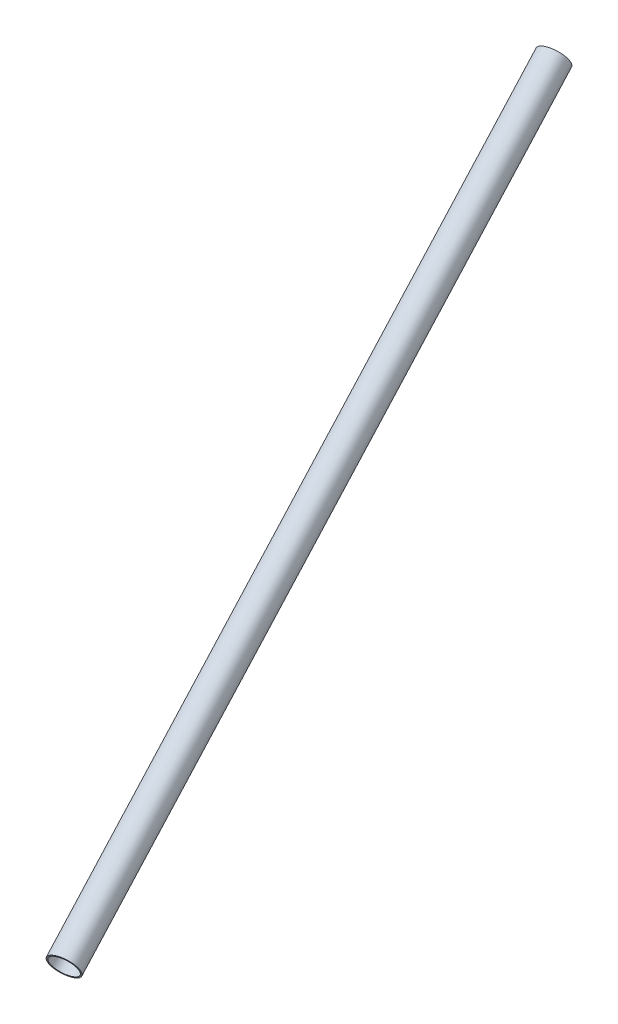
ISO-10303-21;
HEADER;
FILE_DESCRIPTION(('STEP AP214'),'2;1');
FILE_NAME('part.step','',(''),(''),'','','');
FILE_SCHEMA(('AUTOMOTIVE_DESIGN { 1 0 10303 214 1 1 1 1 }'));
ENDSEC;
DATA;
#1=APPLICATION_CONTEXT('core data for automotive mechanical design processes');
#2=APPLICATION_PROTOCOL_DEFINITION('international standard','automotive_design',2000,#1);
#3=PRODUCT_CONTEXT('',#1,'mechanical');
#4=PRODUCT('Part','Part','',(#3));
#5=PRODUCT_RELATED_PRODUCT_CATEGORY('part','',(#4));
#6=PRODUCT_DEFINITION_FORMATION('','',#4);
#7=PRODUCT_DEFINITION_CONTEXT('part definition',#1,'design');
#8=PRODUCT_DEFINITION('design','',#6,#7);
#9=PRODUCT_DEFINITION_SHAPE('','',#8);
#10=(LENGTH_UNIT() NAMED_UNIT(*) SI_UNIT(.MILLI.,.METRE.));
#11=(NAMED_UNIT(*) PLANE_ANGLE_UNIT() SI_UNIT($,.RADIAN.));
#12=(NAMED_UNIT(*) SI_UNIT($,.STERADIAN.) SOLID_ANGLE_UNIT());
#13=UNCERTAINTY_MEASURE_WITH_UNIT(LENGTH_MEASURE(1.E-05),#10,'distance_accuracy_value','');
#14=(GEOMETRIC_REPRESENTATION_CONTEXT(3) GLOBAL_UNCERTAINTY_ASSIGNED_CONTEXT((#13)) GLOBAL_UNIT_ASSIGNED_CONTEXT((#10,
#11,#12)) REPRESENTATION_CONTEXT('',''));
#15=CARTESIAN_POINT('',(0.,0.,0.));
#16=DIRECTION('',(0.,0.,1.));
#17=DIRECTION('',(1.,0.,0.));
#18=AXIS2_PLACEMENT_3D('',#15,#16,#17);
#19=CARTESIAN_POINT('',(-325.,320.000000000001,-1580.));
#20=DIRECTION('',(0.227207840964845,-0.4673512982197,0.85437659205789));
#21=DIRECTION('',(0.,-0.877321812102288,-0.479902529696977));
#22=AXIS2_PLACEMENT_3D('',#19,#20,#21);
#23=CYLINDRICAL_SURFACE('',#22,11.3);
#24=CARTESIAN_POINT('',(-325.,320.000000000001,-1580.));
#25=DIRECTION('',(-0.227207840964845,0.4673512982197,-0.85437659205789));
#26=DIRECTION('',(0.607006832841848,-0.618080420232195,-0.499519067713037));
#27=AXIS2_PLACEMENT_3D('',#24,#25,#26);
#28=CIRCLE('',#27,11.3);
#29=CARTESIAN_POINT('',(-318.140822788887,313.015691251377,-1585.64456546516));
#30=VERTEX_POINT('',#29);
#31=EDGE_CURVE('E46',#30,#30,#28,.T.);
#32=ORIENTED_EDGE('',*,*,#31,.T.);
#33=EDGE_LOOP('',(#32));
#34=FACE_BOUND('',#33,.T.);
#35=CARTESIAN_POINT('',(-169.428571428571,4.44089209850063E-13,-995.));
#36=DIRECTION('',(-0.227207840964845,0.4673512982197,-0.85437659205789));
#37=DIRECTION('',(0.607006832841848,-0.618080420232195,-0.499519067713037));
#38=AXIS2_PLACEMENT_3D('',#35,#36,#37);
#39=CIRCLE('',#38,11.3);
#40=CARTESIAN_POINT('',(-162.569394217458,-6.98430874862336,-1000.64456546516));
#41=VERTEX_POINT('',#40);
#42=EDGE_CURVE('E52',#41,#41,#39,.T.);
#43=ORIENTED_EDGE('',*,*,#42,.F.);
#44=EDGE_LOOP('',(#43));
#45=FACE_BOUND('',#44,.T.);
#46=ADVANCED_FACE('F39',(#34,#45),#23,.F.);
#47=CARTESIAN_POINT('',(-325.,320.000000000001,-1580.));
#48=DIRECTION('',(0.227207840964845,-0.4673512982197,0.85437659205789));
#49=DIRECTION('',(0.,-0.877321812102288,-0.479902529696977));
#50=AXIS2_PLACEMENT_3D('',#47,#48,#49);
#51=CYLINDRICAL_SURFACE('',#50,12.5);
#52=CARTESIAN_POINT('',(-325.,320.000000000001,-1580.));
#53=DIRECTION('',(-0.227207840964845,0.4673512982197,-0.85437659205789));
#54=DIRECTION('',(0.607006832841848,-0.618080420232195,-0.499519067713037));
#55=AXIS2_PLACEMENT_3D('',#52,#53,#54);
#56=CIRCLE('',#55,12.5);
#57=CARTESIAN_POINT('',(-317.412414589476,312.273994747098,-1586.24398834641));
#58=VERTEX_POINT('',#57);
#59=EDGE_CURVE('E10',#58,#58,#56,.T.);
#60=ORIENTED_EDGE('',*,*,#59,.F.);
#61=EDGE_LOOP('',(#60));
#62=FACE_BOUND('',#61,.T.);
#63=CARTESIAN_POINT('',(-169.428571428571,4.44089209850063E-13,-995.));
#64=DIRECTION('',(-0.227207840964845,0.4673512982197,-0.85437659205789));
#65=DIRECTION('',(0.607006832841848,-0.618080420232195,-0.499519067713037));
#66=AXIS2_PLACEMENT_3D('',#63,#64,#65);
#67=CIRCLE('',#66,12.5);
#68=CARTESIAN_POINT('',(-161.840986018048,-7.72600525290201,-1001.24398834641));
#69=VERTEX_POINT('',#68);
#70=EDGE_CURVE('E42',#69,#69,#67,.T.);
#71=ORIENTED_EDGE('',*,*,#70,.T.);
#72=EDGE_LOOP('',(#71));
#73=FACE_BOUND('',#72,.T.);
#74=ADVANCED_FACE('F59',(#62,#73),#51,.T.);
#75=CARTESIAN_POINT('',(-325.,320.000000000001,-1580.));
#76=DIRECTION('',(-0.227207840964845,0.4673512982197,-0.85437659205789));
#77=DIRECTION('',(0.607006832841848,-0.618080420232195,-0.499519067713037));
#78=AXIS2_PLACEMENT_3D('',#75,#76,#77);
#79=PLANE('',#78);
#80=ORIENTED_EDGE('',*,*,#31,.F.);
#81=EDGE_LOOP('',(#80));
#82=FACE_BOUND('',#81,.T.);
#83=ORIENTED_EDGE('',*,*,#59,.T.);
#84=EDGE_LOOP('',(#83));
#85=FACE_BOUND('',#84,.T.);
#86=ADVANCED_FACE('F63',(#82,#85),#79,.T.);
#87=CARTESIAN_POINT('',(-169.428571428571,4.44089209850063E-13,-995.));
#88=DIRECTION('',(-0.227207840964845,0.4673512982197,-0.85437659205789));
#89=DIRECTION('',(0.607006832841848,-0.618080420232195,-0.499519067713037));
#90=AXIS2_PLACEMENT_3D('',#87,#88,#89);
#91=PLANE('',#90);
#92=ORIENTED_EDGE('',*,*,#42,.T.);
#93=EDGE_LOOP('',(#92));
#94=FACE_BOUND('',#93,.T.);
#95=ORIENTED_EDGE('',*,*,#70,.F.);
#96=EDGE_LOOP('',(#95));
#97=FACE_BOUND('',#96,.T.);
#98=ADVANCED_FACE('F61',(#94,#97),#91,.F.);
#99=CLOSED_SHELL('',(#46,#74,#86,#98));
#100=MANIFOLD_SOLID_BREP('B2',#99);
#101=ADVANCED_BREP_SHAPE_REPRESENTATION('',(#18,#100),#14);
#102=SHAPE_DEFINITION_REPRESENTATION(#9,#101);
ENDSEC;
END-ISO-10303-21;
